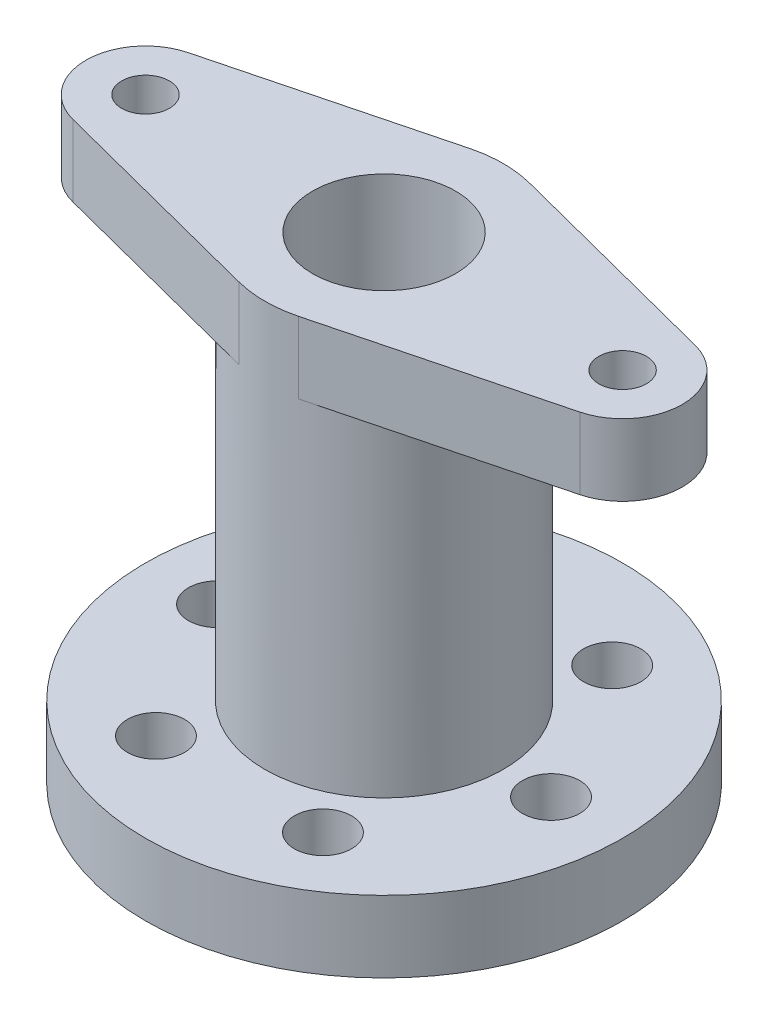
ISO-10303-21;
HEADER;
FILE_DESCRIPTION(('STEP AP214'),'2;1');
FILE_NAME('part.step','',(''),(''),'','','');
FILE_SCHEMA(('AUTOMOTIVE_DESIGN { 1 0 10303 214 1 1 1 1 }'));
ENDSEC;
DATA;
#1=APPLICATION_CONTEXT('core data for automotive mechanical design processes');
#2=APPLICATION_PROTOCOL_DEFINITION('international standard','automotive_design',2000,#1);
#3=PRODUCT_CONTEXT('',#1,'mechanical');
#4=PRODUCT('Part','Part','',(#3));
#5=PRODUCT_RELATED_PRODUCT_CATEGORY('part','',(#4));
#6=PRODUCT_DEFINITION_FORMATION('','',#4);
#7=PRODUCT_DEFINITION_CONTEXT('part definition',#1,'design');
#8=PRODUCT_DEFINITION('design','',#6,#7);
#9=PRODUCT_DEFINITION_SHAPE('','',#8);
#10=(LENGTH_UNIT() NAMED_UNIT(*) SI_UNIT(.MILLI.,.METRE.));
#11=(NAMED_UNIT(*) PLANE_ANGLE_UNIT() SI_UNIT($,.RADIAN.));
#12=(NAMED_UNIT(*) SI_UNIT($,.STERADIAN.) SOLID_ANGLE_UNIT());
#13=UNCERTAINTY_MEASURE_WITH_UNIT(LENGTH_MEASURE(1.E-05),#10,'distance_accuracy_value','');
#14=(GEOMETRIC_REPRESENTATION_CONTEXT(3) GLOBAL_UNCERTAINTY_ASSIGNED_CONTEXT((#13)) GLOBAL_UNIT_ASSIGNED_CONTEXT((#10,
#11,#12)) REPRESENTATION_CONTEXT('',''));
#15=CARTESIAN_POINT('',(0.,0.,0.));
#16=DIRECTION('',(0.,0.,1.));
#17=DIRECTION('',(1.,0.,0.));
#18=AXIS2_PLACEMENT_3D('',#15,#16,#17);
#19=CARTESIAN_POINT('',(0.,15.,0.));
#20=DIRECTION('',(0.,1.,0.));
#21=DIRECTION('',(0.,0.,1.));
#22=AXIS2_PLACEMENT_3D('',#19,#20,#21);
#23=PLANE('',#22);
#24=CARTESIAN_POINT('',(0.,15.,0.));
#25=DIRECTION('',(0.,1.,0.));
#26=DIRECTION('',(0.,0.,1.));
#27=AXIS2_PLACEMENT_3D('',#24,#25,#26);
#28=CIRCLE('',#27,25.);
#29=CARTESIAN_POINT('',(0.,15.,25.));
#30=VERTEX_POINT('',#29);
#31=EDGE_CURVE('E135',#30,#30,#28,.T.);
#32=ORIENTED_EDGE('',*,*,#31,.F.);
#33=EDGE_LOOP('',(#32));
#34=FACE_BOUND('',#33,.T.);
#35=CARTESIAN_POINT('',(17.4999999999997,15.,30.3108891324555));
#36=DIRECTION('',(0.,1.,0.));
#37=DIRECTION('',(0.,0.,1.));
#38=AXIS2_PLACEMENT_3D('',#35,#36,#37);
#39=CIRCLE('',#38,6.);
#40=CARTESIAN_POINT('',(17.4999999999997,15.,36.3108891324555));
#41=VERTEX_POINT('',#40);
#42=EDGE_CURVE('E157',#41,#41,#39,.T.);
#43=ORIENTED_EDGE('',*,*,#42,.F.);
#44=EDGE_LOOP('',(#43));
#45=FACE_BOUND('',#44,.T.);
#46=CARTESIAN_POINT('',(17.5000000000001,15.,-30.3108891324553));
#47=DIRECTION('',(0.,1.,0.));
#48=DIRECTION('',(0.,0.,1.));
#49=AXIS2_PLACEMENT_3D('',#46,#47,#48);
#50=CIRCLE('',#49,6.);
#51=CARTESIAN_POINT('',(17.5000000000001,15.,-24.3108891324553));
#52=VERTEX_POINT('',#51);
#53=EDGE_CURVE('E173',#52,#52,#50,.T.);
#54=ORIENTED_EDGE('',*,*,#53,.F.);
#55=EDGE_LOOP('',(#54));
#56=FACE_BOUND('',#55,.T.);
#57=CARTESIAN_POINT('',(-35.,15.,0.));
#58=DIRECTION('',(0.,1.,0.));
#59=DIRECTION('',(0.,0.,1.));
#60=AXIS2_PLACEMENT_3D('',#57,#58,#59);
#61=CIRCLE('',#60,6.);
#62=CARTESIAN_POINT('',(-35.,15.,6.));
#63=VERTEX_POINT('',#62);
#64=EDGE_CURVE('E189',#63,#63,#61,.T.);
#65=ORIENTED_EDGE('',*,*,#64,.F.);
#66=EDGE_LOOP('',(#65));
#67=FACE_BOUND('',#66,.T.);
#68=CARTESIAN_POINT('',(0.,15.,0.));
#69=DIRECTION('',(0.,1.,0.));
#70=DIRECTION('',(0.,0.,1.));
#71=AXIS2_PLACEMENT_3D('',#68,#69,#70);
#72=CIRCLE('',#71,50.);
#73=CARTESIAN_POINT('',(0.,15.,50.));
#74=VERTEX_POINT('',#73);
#75=EDGE_CURVE('E51',#74,#74,#72,.T.);
#76=ORIENTED_EDGE('',*,*,#75,.T.);
#77=EDGE_LOOP('',(#76));
#78=FACE_BOUND('',#77,.T.);
#79=CARTESIAN_POINT('',(-17.4999999999999,15.,-30.3108891324554));
#80=DIRECTION('',(0.,1.,0.));
#81=DIRECTION('',(0.,0.,1.));
#82=AXIS2_PLACEMENT_3D('',#79,#80,#81);
#83=CIRCLE('',#82,6.);
#84=CARTESIAN_POINT('',(-17.4999999999999,15.,-24.3108891324554));
#85=VERTEX_POINT('',#84);
#86=EDGE_CURVE('E181',#85,#85,#83,.T.);
#87=ORIENTED_EDGE('',*,*,#86,.F.);
#88=EDGE_LOOP('',(#87));
#89=FACE_BOUND('',#88,.T.);
#90=CARTESIAN_POINT('',(35.,15.,2.44403693719019E-13));
#91=DIRECTION('',(0.,1.,0.));
#92=DIRECTION('',(0.,0.,1.));
#93=AXIS2_PLACEMENT_3D('',#90,#91,#92);
#94=CIRCLE('',#93,6.);
#95=CARTESIAN_POINT('',(35.,15.,6.00000000000025));
#96=VERTEX_POINT('',#95);
#97=EDGE_CURVE('E165',#96,#96,#94,.T.);
#98=ORIENTED_EDGE('',*,*,#97,.F.);
#99=EDGE_LOOP('',(#98));
#100=FACE_BOUND('',#99,.T.);
#101=CARTESIAN_POINT('',(-17.5000000000004,15.,30.3108891324552));
#102=DIRECTION('',(0.,1.,0.));
#103=DIRECTION('',(0.,0.,1.));
#104=AXIS2_PLACEMENT_3D('',#101,#102,#103);
#105=CIRCLE('',#104,6.);
#106=CARTESIAN_POINT('',(-17.5000000000004,15.,36.3108891324552));
#107=VERTEX_POINT('',#106);
#108=EDGE_CURVE('E149',#107,#107,#105,.T.);
#109=ORIENTED_EDGE('',*,*,#108,.F.);
#110=EDGE_LOOP('',(#109));
#111=FACE_BOUND('',#110,.T.);
#112=ADVANCED_FACE('F42',(#34,#45,#56,#67,#78,#89,#100,#111),#23,.T.);
#113=CARTESIAN_POINT('',(0.,0.,0.));
#114=DIRECTION('',(0.,1.,0.));
#115=DIRECTION('',(0.,0.,1.));
#116=AXIS2_PLACEMENT_3D('',#113,#114,#115);
#117=PLANE('',#116);
#118=CARTESIAN_POINT('',(0.,0.,0.));
#119=DIRECTION('',(0.,1.,0.));
#120=DIRECTION('',(0.,0.,1.));
#121=AXIS2_PLACEMENT_3D('',#118,#119,#120);
#122=CIRCLE('',#121,50.);
#123=CARTESIAN_POINT('',(0.,0.,50.));
#124=VERTEX_POINT('',#123);
#125=EDGE_CURVE('E193',#124,#124,#122,.T.);
#126=ORIENTED_EDGE('',*,*,#125,.F.);
#127=EDGE_LOOP('',(#126));
#128=FACE_BOUND('',#127,.T.);
#129=CARTESIAN_POINT('',(-35.,0.,0.));
#130=DIRECTION('',(0.,1.,0.));
#131=DIRECTION('',(0.,0.,1.));
#132=AXIS2_PLACEMENT_3D('',#129,#130,#131);
#133=CIRCLE('',#132,6.);
#134=CARTESIAN_POINT('',(-35.,0.,6.));
#135=VERTEX_POINT('',#134);
#136=EDGE_CURVE('E185',#135,#135,#133,.T.);
#137=ORIENTED_EDGE('',*,*,#136,.T.);
#138=EDGE_LOOP('',(#137));
#139=FACE_BOUND('',#138,.T.);
#140=CARTESIAN_POINT('',(-17.4999999999999,0.,-30.3108891324554));
#141=DIRECTION('',(0.,1.,0.));
#142=DIRECTION('',(0.,0.,1.));
#143=AXIS2_PLACEMENT_3D('',#140,#141,#142);
#144=CIRCLE('',#143,6.);
#145=CARTESIAN_POINT('',(-17.4999999999999,0.,-24.3108891324554));
#146=VERTEX_POINT('',#145);
#147=EDGE_CURVE('E177',#146,#146,#144,.T.);
#148=ORIENTED_EDGE('',*,*,#147,.T.);
#149=EDGE_LOOP('',(#148));
#150=FACE_BOUND('',#149,.T.);
#151=CARTESIAN_POINT('',(17.5000000000001,0.,-30.3108891324553));
#152=DIRECTION('',(0.,1.,0.));
#153=DIRECTION('',(0.,0.,1.));
#154=AXIS2_PLACEMENT_3D('',#151,#152,#153);
#155=CIRCLE('',#154,6.);
#156=CARTESIAN_POINT('',(17.5000000000001,0.,-24.3108891324553));
#157=VERTEX_POINT('',#156);
#158=EDGE_CURVE('E169',#157,#157,#155,.T.);
#159=ORIENTED_EDGE('',*,*,#158,.T.);
#160=EDGE_LOOP('',(#159));
#161=FACE_BOUND('',#160,.T.);
#162=CARTESIAN_POINT('',(35.,0.,2.44403693719019E-13));
#163=DIRECTION('',(0.,1.,0.));
#164=DIRECTION('',(0.,0.,1.));
#165=AXIS2_PLACEMENT_3D('',#162,#163,#164);
#166=CIRCLE('',#165,6.);
#167=CARTESIAN_POINT('',(35.,0.,6.00000000000025));
#168=VERTEX_POINT('',#167);
#169=EDGE_CURVE('E161',#168,#168,#166,.T.);
#170=ORIENTED_EDGE('',*,*,#169,.T.);
#171=EDGE_LOOP('',(#170));
#172=FACE_BOUND('',#171,.T.);
#173=CARTESIAN_POINT('',(17.4999999999997,0.,30.3108891324555));
#174=DIRECTION('',(0.,1.,0.));
#175=DIRECTION('',(0.,0.,1.));
#176=AXIS2_PLACEMENT_3D('',#173,#174,#175);
#177=CIRCLE('',#176,6.);
#178=CARTESIAN_POINT('',(17.4999999999997,0.,36.3108891324555));
#179=VERTEX_POINT('',#178);
#180=EDGE_CURVE('E153',#179,#179,#177,.T.);
#181=ORIENTED_EDGE('',*,*,#180,.T.);
#182=EDGE_LOOP('',(#181));
#183=FACE_BOUND('',#182,.T.);
#184=CARTESIAN_POINT('',(-17.5000000000004,0.,30.3108891324552));
#185=DIRECTION('',(0.,1.,0.));
#186=DIRECTION('',(0.,0.,1.));
#187=AXIS2_PLACEMENT_3D('',#184,#185,#186);
#188=CIRCLE('',#187,6.);
#189=CARTESIAN_POINT('',(-17.5000000000004,0.,36.3108891324552));
#190=VERTEX_POINT('',#189);
#191=EDGE_CURVE('E147',#190,#190,#188,.T.);
#192=ORIENTED_EDGE('',*,*,#191,.T.);
#193=EDGE_LOOP('',(#192));
#194=FACE_BOUND('',#193,.T.);
#195=ADVANCED_FACE('F204',(#128,#139,#150,#161,#172,#183,#194),#117,.F.);
#196=CARTESIAN_POINT('',(0.,15.,0.));
#197=DIRECTION('',(0.,-1.,0.));
#198=DIRECTION('',(0.,0.,-1.));
#199=AXIS2_PLACEMENT_3D('',#196,#197,#198);
#200=CYLINDRICAL_SURFACE('',#199,50.);
#201=ORIENTED_EDGE('',*,*,#75,.F.);
#202=EDGE_LOOP('',(#201));
#203=FACE_BOUND('',#202,.T.);
#204=ORIENTED_EDGE('',*,*,#125,.T.);
#205=EDGE_LOOP('',(#204));
#206=FACE_BOUND('',#205,.T.);
#207=ADVANCED_FACE('F44',(#203,#206),#200,.T.);
#208=CARTESIAN_POINT('',(-35.,15.,0.));
#209=DIRECTION('',(0.,-1.,0.));
#210=DIRECTION('',(0.,0.,-1.));
#211=AXIS2_PLACEMENT_3D('',#208,#209,#210);
#212=CYLINDRICAL_SURFACE('',#211,6.);
#213=ORIENTED_EDGE('',*,*,#64,.T.);
#214=EDGE_LOOP('',(#213));
#215=FACE_BOUND('',#214,.T.);
#216=ORIENTED_EDGE('',*,*,#136,.F.);
#217=EDGE_LOOP('',(#216));
#218=FACE_BOUND('',#217,.T.);
#219=ADVANCED_FACE('F527',(#215,#218),#212,.F.);
#220=CARTESIAN_POINT('',(-17.4999999999999,15.,-30.3108891324554));
#221=DIRECTION('',(0.,-1.,0.));
#222=DIRECTION('',(0.,0.,-1.));
#223=AXIS2_PLACEMENT_3D('',#220,#221,#222);
#224=CYLINDRICAL_SURFACE('',#223,6.);
#225=ORIENTED_EDGE('',*,*,#86,.T.);
#226=EDGE_LOOP('',(#225));
#227=FACE_BOUND('',#226,.T.);
#228=ORIENTED_EDGE('',*,*,#147,.F.);
#229=EDGE_LOOP('',(#228));
#230=FACE_BOUND('',#229,.T.);
#231=ADVANCED_FACE('F516',(#227,#230),#224,.F.);
#232=CARTESIAN_POINT('',(17.5000000000001,15.,-30.3108891324553));
#233=DIRECTION('',(0.,-1.,0.));
#234=DIRECTION('',(0.,0.,-1.));
#235=AXIS2_PLACEMENT_3D('',#232,#233,#234);
#236=CYLINDRICAL_SURFACE('',#235,6.);
#237=ORIENTED_EDGE('',*,*,#53,.T.);
#238=EDGE_LOOP('',(#237));
#239=FACE_BOUND('',#238,.T.);
#240=ORIENTED_EDGE('',*,*,#158,.F.);
#241=EDGE_LOOP('',(#240));
#242=FACE_BOUND('',#241,.T.);
#243=ADVANCED_FACE('F505',(#239,#242),#236,.F.);
#244=CARTESIAN_POINT('',(35.,15.,2.44403693719019E-13));
#245=DIRECTION('',(0.,-1.,0.));
#246=DIRECTION('',(0.,0.,-1.));
#247=AXIS2_PLACEMENT_3D('',#244,#245,#246);
#248=CYLINDRICAL_SURFACE('',#247,6.);
#249=ORIENTED_EDGE('',*,*,#97,.T.);
#250=EDGE_LOOP('',(#249));
#251=FACE_BOUND('',#250,.T.);
#252=ORIENTED_EDGE('',*,*,#169,.F.);
#253=EDGE_LOOP('',(#252));
#254=FACE_BOUND('',#253,.T.);
#255=ADVANCED_FACE('F231',(#251,#254),#248,.F.);
#256=CARTESIAN_POINT('',(17.4999999999997,15.,30.3108891324555));
#257=DIRECTION('',(0.,-1.,0.));
#258=DIRECTION('',(0.,0.,-1.));
#259=AXIS2_PLACEMENT_3D('',#256,#257,#258);
#260=CYLINDRICAL_SURFACE('',#259,6.);
#261=ORIENTED_EDGE('',*,*,#42,.T.);
#262=EDGE_LOOP('',(#261));
#263=FACE_BOUND('',#262,.T.);
#264=ORIENTED_EDGE('',*,*,#180,.F.);
#265=EDGE_LOOP('',(#264));
#266=FACE_BOUND('',#265,.T.);
#267=ADVANCED_FACE('F222',(#263,#266),#260,.F.);
#268=CARTESIAN_POINT('',(-17.5000000000004,15.,30.3108891324552));
#269=DIRECTION('',(0.,-1.,0.));
#270=DIRECTION('',(0.,0.,-1.));
#271=AXIS2_PLACEMENT_3D('',#268,#269,#270);
#272=CYLINDRICAL_SURFACE('',#271,6.);
#273=ORIENTED_EDGE('',*,*,#108,.T.);
#274=EDGE_LOOP('',(#273));
#275=FACE_BOUND('',#274,.T.);
#276=ORIENTED_EDGE('',*,*,#191,.F.);
#277=EDGE_LOOP('',(#276));
#278=FACE_BOUND('',#277,.T.);
#279=ADVANCED_FACE('F219',(#275,#278),#272,.F.);
#280=CARTESIAN_POINT('',(0.,85.,0.));
#281=DIRECTION('',(0.,-1.,0.));
#282=DIRECTION('',(0.,0.,-1.));
#283=AXIS2_PLACEMENT_3D('',#280,#281,#282);
#284=CYLINDRICAL_SURFACE('',#283,25.);
#285=CARTESIAN_POINT('',(0.,85.,0.));
#286=DIRECTION('',(0.,1.,0.));
#287=DIRECTION('',(0.,0.,1.));
#288=AXIS2_PLACEMENT_3D('',#285,#286,#287);
#289=CIRCLE('',#288,25.);
#290=CARTESIAN_POINT('',(6.25000000000001,85.,24.2061459137964));
#291=VERTEX_POINT('',#290);
#292=CARTESIAN_POINT('',(6.25000000000001,85.,-24.2061459137964));
#293=VERTEX_POINT('',#292);
#294=EDGE_CURVE('E145',#291,#293,#289,.T.);
#295=ORIENTED_EDGE('',*,*,#294,.F.);
#296=DIRECTION('',(0.,-1.,0.));
#297=VECTOR('',#296,1.);
#298=CARTESIAN_POINT('',(6.25000000000001,100.,24.2061459137964));
#299=LINE('',#298,#297);
#300=CARTESIAN_POINT('',(6.25000000000001,100.,24.2061459137964));
#301=VERTEX_POINT('',#300);
#302=EDGE_CURVE('E141',#301,#291,#299,.T.);
#303=ORIENTED_EDGE('',*,*,#302,.F.);
#304=CARTESIAN_POINT('',(0.,100.,0.));
#305=DIRECTION('',(0.,1.,0.));
#306=DIRECTION('',(0.,0.,1.));
#307=AXIS2_PLACEMENT_3D('',#304,#305,#306);
#308=CIRCLE('',#307,25.);
#309=CARTESIAN_POINT('',(-6.25000000000001,100.,24.2061459137964));
#310=VERTEX_POINT('',#309);
#311=EDGE_CURVE('E118',#310,#301,#308,.T.);
#312=ORIENTED_EDGE('',*,*,#311,.F.);
#313=DIRECTION('',(0.,-1.,0.));
#314=VECTOR('',#313,1.);
#315=CARTESIAN_POINT('',(-6.25000000000001,100.,24.2061459137964));
#316=LINE('',#315,#314);
#317=CARTESIAN_POINT('',(-6.25000000000001,85.,24.2061459137964));
#318=VERTEX_POINT('',#317);
#319=EDGE_CURVE('E114',#310,#318,#316,.T.);
#320=ORIENTED_EDGE('',*,*,#319,.T.);
#321=CARTESIAN_POINT('',(-6.25000000000001,85.,-24.2061459137964));
#322=VERTEX_POINT('',#321);
#323=EDGE_CURVE('E58',#322,#318,#289,.T.);
#324=ORIENTED_EDGE('',*,*,#323,.F.);
#325=DIRECTION('',(0.,-1.,0.));
#326=VECTOR('',#325,1.);
#327=CARTESIAN_POINT('',(-6.25000000000001,100.,-24.2061459137964));
#328=LINE('',#327,#326);
#329=CARTESIAN_POINT('',(-6.25000000000001,100.,-24.2061459137964));
#330=VERTEX_POINT('',#329);
#331=EDGE_CURVE('E313',#330,#322,#328,.T.);
#332=ORIENTED_EDGE('',*,*,#331,.F.);
#333=CARTESIAN_POINT('',(0.,100.,0.));
#334=DIRECTION('',(0.,1.,0.));
#335=DIRECTION('',(0.,0.,1.));
#336=AXIS2_PLACEMENT_3D('',#333,#334,#335);
#337=CIRCLE('',#336,25.);
#338=CARTESIAN_POINT('',(6.25000000000001,100.,-24.2061459137964));
#339=VERTEX_POINT('',#338);
#340=EDGE_CURVE('E350',#339,#330,#337,.T.);
#341=ORIENTED_EDGE('',*,*,#340,.F.);
#342=DIRECTION('',(0.,-1.,0.));
#343=VECTOR('',#342,1.);
#344=CARTESIAN_POINT('',(6.25000000000001,100.,-24.2061459137964));
#345=LINE('',#344,#343);
#346=EDGE_CURVE('E316',#339,#293,#345,.T.);
#347=ORIENTED_EDGE('',*,*,#346,.T.);
#348=EDGE_LOOP('',(#295,#303,#312,#320,#324,#332,#341,#347));
#349=FACE_BOUND('',#348,.T.);
#350=ORIENTED_EDGE('',*,*,#31,.T.);
#351=EDGE_LOOP('',(#350));
#352=FACE_BOUND('',#351,.T.);
#353=ADVANCED_FACE('F221',(#349,#352),#284,.T.);
#354=CARTESIAN_POINT('',(-50.,85.,0.));
#355=DIRECTION('',(0.,1.,0.));
#356=DIRECTION('',(0.,0.,1.));
#357=AXIS2_PLACEMENT_3D('',#354,#355,#356);
#358=PLANE('',#357);
#359=CARTESIAN_POINT('',(50.,85.,0.));
#360=DIRECTION('',(0.,1.,0.));
#361=DIRECTION('',(0.,0.,1.));
#362=AXIS2_PLACEMENT_3D('',#359,#360,#361);
#363=CIRCLE('',#362,5.);
#364=CARTESIAN_POINT('',(50.,85.,5.));
#365=VERTEX_POINT('',#364);
#366=EDGE_CURVE('E347',#365,#365,#363,.T.);
#367=ORIENTED_EDGE('',*,*,#366,.T.);
#368=EDGE_LOOP('',(#367));
#369=FACE_BOUND('',#368,.T.);
#370=DIRECTION('',(0.968245836551854,0.,-0.25));
#371=VECTOR('',#370,1.);
#372=CARTESIAN_POINT('',(53.125,85.,12.1030729568982));
#373=LINE('',#372,#371);
#374=CARTESIAN_POINT('',(53.125,85.,12.1030729568982));
#375=VERTEX_POINT('',#374);
#376=EDGE_CURVE('E333',#291,#375,#373,.T.);
#377=ORIENTED_EDGE('',*,*,#376,.F.);
#378=ORIENTED_EDGE('',*,*,#294,.T.);
#379=DIRECTION('',(-0.968245836551854,0.,-0.25));
#380=VECTOR('',#379,1.);
#381=CARTESIAN_POINT('',(53.125,85.,-12.1030729568982));
#382=LINE('',#381,#380);
#383=CARTESIAN_POINT('',(53.125,85.,-12.1030729568982));
#384=VERTEX_POINT('',#383);
#385=EDGE_CURVE('E302',#384,#293,#382,.T.);
#386=ORIENTED_EDGE('',*,*,#385,.F.);
#387=CARTESIAN_POINT('',(50.,85.,0.));
#388=DIRECTION('',(0.,1.,0.));
#389=DIRECTION('',(0.,0.,1.));
#390=AXIS2_PLACEMENT_3D('',#387,#388,#389);
#391=CIRCLE('',#390,12.5);
#392=EDGE_CURVE('E306',#375,#384,#391,.T.);
#393=ORIENTED_EDGE('',*,*,#392,.F.);
#394=EDGE_LOOP('',(#377,#378,#386,#393));
#395=FACE_BOUND('',#394,.T.);
#396=ADVANCED_FACE('F229',(#369,#395),#358,.F.);
#397=CARTESIAN_POINT('',(-50.,85.,0.));
#398=DIRECTION('',(0.,1.,0.));
#399=DIRECTION('',(0.,0.,1.));
#400=AXIS2_PLACEMENT_3D('',#397,#398,#399);
#401=CIRCLE('',#400,5.);
#402=CARTESIAN_POINT('',(-50.,85.,5.));
#403=VERTEX_POINT('',#402);
#404=EDGE_CURVE('E300',#403,#403,#401,.T.);
#405=ORIENTED_EDGE('',*,*,#404,.T.);
#406=EDGE_LOOP('',(#405));
#407=FACE_BOUND('',#406,.T.);
#408=DIRECTION('',(-0.968245836551854,0.,0.25));
#409=VECTOR('',#408,1.);
#410=CARTESIAN_POINT('',(-53.125,85.,-12.1030729568982));
#411=LINE('',#410,#409);
#412=CARTESIAN_POINT('',(-53.125,85.,-12.1030729568982));
#413=VERTEX_POINT('',#412);
#414=EDGE_CURVE('E129',#322,#413,#411,.T.);
#415=ORIENTED_EDGE('',*,*,#414,.F.);
#416=ORIENTED_EDGE('',*,*,#323,.T.);
#417=DIRECTION('',(0.968245836551854,0.,0.25));
#418=VECTOR('',#417,1.);
#419=CARTESIAN_POINT('',(-53.125,85.,12.1030729568982));
#420=LINE('',#419,#418);
#421=CARTESIAN_POINT('',(-53.125,85.,12.1030729568982));
#422=VERTEX_POINT('',#421);
#423=EDGE_CURVE('E339',#422,#318,#420,.T.);
#424=ORIENTED_EDGE('',*,*,#423,.F.);
#425=CARTESIAN_POINT('',(-50.,85.,0.));
#426=DIRECTION('',(0.,1.,0.));
#427=DIRECTION('',(0.,0.,1.));
#428=AXIS2_PLACEMENT_3D('',#425,#426,#427);
#429=CIRCLE('',#428,12.5);
#430=EDGE_CURVE('E133',#413,#422,#429,.T.);
#431=ORIENTED_EDGE('',*,*,#430,.F.);
#432=EDGE_LOOP('',(#415,#416,#424,#431));
#433=FACE_BOUND('',#432,.T.);
#434=ADVANCED_FACE('F272',(#407,#433),#358,.F.);
#435=CARTESIAN_POINT('',(-50.,100.,0.));
#436=DIRECTION('',(0.,-1.,0.));
#437=DIRECTION('',(0.,0.,-1.));
#438=AXIS2_PLACEMENT_3D('',#435,#436,#437);
#439=CYLINDRICAL_SURFACE('',#438,12.5);
#440=ORIENTED_EDGE('',*,*,#430,.T.);
#441=DIRECTION('',(0.,-1.,0.));
#442=VECTOR('',#441,1.);
#443=CARTESIAN_POINT('',(-53.125,100.,12.1030729568982));
#444=LINE('',#443,#442);
#445=CARTESIAN_POINT('',(-53.125,100.,12.1030729568982));
#446=VERTEX_POINT('',#445);
#447=EDGE_CURVE('E112',#446,#422,#444,.T.);
#448=ORIENTED_EDGE('',*,*,#447,.F.);
#449=CARTESIAN_POINT('',(-50.,100.,0.));
#450=DIRECTION('',(0.,1.,0.));
#451=DIRECTION('',(0.,0.,1.));
#452=AXIS2_PLACEMENT_3D('',#449,#450,#451);
#453=CIRCLE('',#452,12.5);
#454=CARTESIAN_POINT('',(-53.125,100.,-12.1030729568982));
#455=VERTEX_POINT('',#454);
#456=EDGE_CURVE('E119',#455,#446,#453,.T.);
#457=ORIENTED_EDGE('',*,*,#456,.F.);
#458=DIRECTION('',(0.,-1.,0.));
#459=VECTOR('',#458,1.);
#460=CARTESIAN_POINT('',(-53.125,100.,-12.1030729568982));
#461=LINE('',#460,#459);
#462=EDGE_CURVE('E310',#455,#413,#461,.T.);
#463=ORIENTED_EDGE('',*,*,#462,.T.);
#464=EDGE_LOOP('',(#440,#448,#457,#463));
#465=FACE_BOUND('',#464,.T.);
#466=ADVANCED_FACE('F131',(#465),#439,.T.);
#467=CARTESIAN_POINT('',(-53.125,100.,12.1030729568982));
#468=DIRECTION('',(0.25,0.,-0.968245836551854));
#469=DIRECTION('',(-0.968245836551854,0.,-0.25));
#470=AXIS2_PLACEMENT_3D('',#467,#468,#469);
#471=PLANE('',#470);
#472=ORIENTED_EDGE('',*,*,#423,.T.);
#473=ORIENTED_EDGE('',*,*,#319,.F.);
#474=DIRECTION('',(0.968245836551854,0.,0.25));
#475=VECTOR('',#474,1.);
#476=CARTESIAN_POINT('',(-53.125,100.,12.1030729568982));
#477=LINE('',#476,#475);
#478=EDGE_CURVE('E108',#446,#310,#477,.T.);
#479=ORIENTED_EDGE('',*,*,#478,.F.);
#480=ORIENTED_EDGE('',*,*,#447,.T.);
#481=EDGE_LOOP('',(#472,#473,#479,#480));
#482=FACE_BOUND('',#481,.T.);
#483=ADVANCED_FACE('F110',(#482),#471,.F.);
#484=CARTESIAN_POINT('',(53.125,100.,12.1030729568982));
#485=DIRECTION('',(-0.25,0.,-0.968245836551854));
#486=DIRECTION('',(-0.968245836551854,0.,0.25));
#487=AXIS2_PLACEMENT_3D('',#484,#485,#486);
#488=PLANE('',#487);
#489=ORIENTED_EDGE('',*,*,#376,.T.);
#490=DIRECTION('',(0.,-1.,0.));
#491=VECTOR('',#490,1.);
#492=CARTESIAN_POINT('',(53.125,100.,12.1030729568982));
#493=LINE('',#492,#491);
#494=CARTESIAN_POINT('',(53.125,100.,12.1030729568982));
#495=VERTEX_POINT('',#494);
#496=EDGE_CURVE('E324',#495,#375,#493,.T.);
#497=ORIENTED_EDGE('',*,*,#496,.F.);
#498=DIRECTION('',(0.968245836551854,0.,-0.25));
#499=VECTOR('',#498,1.);
#500=CARTESIAN_POINT('',(53.125,100.,12.1030729568982));
#501=LINE('',#500,#499);
#502=EDGE_CURVE('E334',#301,#495,#501,.T.);
#503=ORIENTED_EDGE('',*,*,#502,.F.);
#504=ORIENTED_EDGE('',*,*,#302,.T.);
#505=EDGE_LOOP('',(#489,#497,#503,#504));
#506=FACE_BOUND('',#505,.T.);
#507=ADVANCED_FACE('F284',(#506),#488,.F.);
#508=CARTESIAN_POINT('',(50.,100.,0.));
#509=DIRECTION('',(0.,-1.,0.));
#510=DIRECTION('',(0.,0.,-1.));
#511=AXIS2_PLACEMENT_3D('',#508,#509,#510);
#512=CYLINDRICAL_SURFACE('',#511,12.5);
#513=ORIENTED_EDGE('',*,*,#392,.T.);
#514=DIRECTION('',(0.,-1.,0.));
#515=VECTOR('',#514,1.);
#516=CARTESIAN_POINT('',(53.125,100.,-12.1030729568982));
#517=LINE('',#516,#515);
#518=CARTESIAN_POINT('',(53.125,100.,-12.1030729568982));
#519=VERTEX_POINT('',#518);
#520=EDGE_CURVE('E320',#519,#384,#517,.T.);
#521=ORIENTED_EDGE('',*,*,#520,.F.);
#522=CARTESIAN_POINT('',(50.,100.,0.));
#523=DIRECTION('',(0.,1.,0.));
#524=DIRECTION('',(0.,0.,1.));
#525=AXIS2_PLACEMENT_3D('',#522,#523,#524);
#526=CIRCLE('',#525,12.5);
#527=EDGE_CURVE('E356',#495,#519,#526,.T.);
#528=ORIENTED_EDGE('',*,*,#527,.F.);
#529=ORIENTED_EDGE('',*,*,#496,.T.);
#530=EDGE_LOOP('',(#513,#521,#528,#529));
#531=FACE_BOUND('',#530,.T.);
#532=ADVANCED_FACE('F280',(#531),#512,.T.);
#533=CARTESIAN_POINT('',(53.125,100.,-12.1030729568982));
#534=DIRECTION('',(-0.25,0.,0.968245836551854));
#535=DIRECTION('',(0.968245836551854,0.,0.25));
#536=AXIS2_PLACEMENT_3D('',#533,#534,#535);
#537=PLANE('',#536);
#538=ORIENTED_EDGE('',*,*,#385,.T.);
#539=ORIENTED_EDGE('',*,*,#346,.F.);
#540=DIRECTION('',(-0.968245836551854,0.,-0.25));
#541=VECTOR('',#540,1.);
#542=CARTESIAN_POINT('',(53.125,100.,-12.1030729568982));
#543=LINE('',#542,#541);
#544=EDGE_CURVE('E353',#519,#339,#543,.T.);
#545=ORIENTED_EDGE('',*,*,#544,.F.);
#546=ORIENTED_EDGE('',*,*,#520,.T.);
#547=EDGE_LOOP('',(#538,#539,#545,#546));
#548=FACE_BOUND('',#547,.T.);
#549=ADVANCED_FACE('F276',(#548),#537,.F.);
#550=CARTESIAN_POINT('',(-53.125,100.,-12.1030729568982));
#551=DIRECTION('',(0.25,0.,0.968245836551854));
#552=DIRECTION('',(0.968245836551854,0.,-0.25));
#553=AXIS2_PLACEMENT_3D('',#550,#551,#552);
#554=PLANE('',#553);
#555=ORIENTED_EDGE('',*,*,#414,.T.);
#556=ORIENTED_EDGE('',*,*,#462,.F.);
#557=DIRECTION('',(-0.968245836551854,0.,0.25));
#558=VECTOR('',#557,1.);
#559=CARTESIAN_POINT('',(-53.125,100.,-12.1030729568982));
#560=LINE('',#559,#558);
#561=EDGE_CURVE('E124',#330,#455,#560,.T.);
#562=ORIENTED_EDGE('',*,*,#561,.F.);
#563=ORIENTED_EDGE('',*,*,#331,.T.);
#564=EDGE_LOOP('',(#555,#556,#562,#563));
#565=FACE_BOUND('',#564,.T.);
#566=ADVANCED_FACE('F268',(#565),#554,.F.);
#567=CARTESIAN_POINT('',(-50.,100.,0.));
#568=DIRECTION('',(0.,1.,0.));
#569=DIRECTION('',(0.,0.,1.));
#570=AXIS2_PLACEMENT_3D('',#567,#568,#569);
#571=PLANE('',#570);
#572=CARTESIAN_POINT('',(50.,100.,0.));
#573=DIRECTION('',(0.,1.,0.));
#574=DIRECTION('',(0.,0.,1.));
#575=AXIS2_PLACEMENT_3D('',#572,#573,#574);
#576=CIRCLE('',#575,5.);
#577=CARTESIAN_POINT('',(50.,100.,5.));
#578=VERTEX_POINT('',#577);
#579=EDGE_CURVE('E373',#578,#578,#576,.T.);
#580=ORIENTED_EDGE('',*,*,#579,.F.);
#581=EDGE_LOOP('',(#580));
#582=FACE_BOUND('',#581,.T.);
#583=CARTESIAN_POINT('',(-50.,100.,0.));
#584=DIRECTION('',(0.,1.,0.));
#585=DIRECTION('',(0.,0.,1.));
#586=AXIS2_PLACEMENT_3D('',#583,#584,#585);
#587=CIRCLE('',#586,5.);
#588=CARTESIAN_POINT('',(-50.,100.,5.));
#589=VERTEX_POINT('',#588);
#590=EDGE_CURVE('E372',#589,#589,#587,.T.);
#591=ORIENTED_EDGE('',*,*,#590,.F.);
#592=EDGE_LOOP('',(#591));
#593=FACE_BOUND('',#592,.T.);
#594=CARTESIAN_POINT('',(0.,100.,0.));
#595=DIRECTION('',(0.,1.,0.));
#596=DIRECTION('',(0.,0.,1.));
#597=AXIS2_PLACEMENT_3D('',#594,#595,#596);
#598=CIRCLE('',#597,15.);
#599=CARTESIAN_POINT('',(0.,100.,15.));
#600=VERTEX_POINT('',#599);
#601=EDGE_CURVE('E368',#600,#600,#598,.T.);
#602=ORIENTED_EDGE('',*,*,#601,.F.);
#603=EDGE_LOOP('',(#602));
#604=FACE_BOUND('',#603,.T.);
#605=ORIENTED_EDGE('',*,*,#456,.T.);
#606=ORIENTED_EDGE('',*,*,#478,.T.);
#607=ORIENTED_EDGE('',*,*,#311,.T.);
#608=ORIENTED_EDGE('',*,*,#502,.T.);
#609=ORIENTED_EDGE('',*,*,#527,.T.);
#610=ORIENTED_EDGE('',*,*,#544,.T.);
#611=ORIENTED_EDGE('',*,*,#340,.T.);
#612=ORIENTED_EDGE('',*,*,#561,.T.);
#613=EDGE_LOOP('',(#605,#606,#607,#608,#609,#610,#611,#612));
#614=FACE_BOUND('',#613,.T.);
#615=ADVANCED_FACE('F122',(#582,#593,#604,#614),#571,.T.);
#616=CARTESIAN_POINT('',(-50.,60.,0.));
#617=DIRECTION('',(0.,1.,0.));
#618=DIRECTION('',(0.,0.,1.));
#619=AXIS2_PLACEMENT_3D('',#616,#617,#618);
#620=CYLINDRICAL_SURFACE('',#619,5.);
#621=ORIENTED_EDGE('',*,*,#590,.T.);
#622=EDGE_LOOP('',(#621));
#623=FACE_BOUND('',#622,.T.);
#624=ORIENTED_EDGE('',*,*,#404,.F.);
#625=EDGE_LOOP('',(#624));
#626=FACE_BOUND('',#625,.T.);
#627=ADVANCED_FACE('F253',(#623,#626),#620,.F.);
#628=CARTESIAN_POINT('',(50.,60.,0.));
#629=DIRECTION('',(0.,1.,0.));
#630=DIRECTION('',(0.,0.,1.));
#631=AXIS2_PLACEMENT_3D('',#628,#629,#630);
#632=CYLINDRICAL_SURFACE('',#631,5.);
#633=ORIENTED_EDGE('',*,*,#579,.T.);
#634=EDGE_LOOP('',(#633));
#635=FACE_BOUND('',#634,.T.);
#636=ORIENTED_EDGE('',*,*,#366,.F.);
#637=EDGE_LOOP('',(#636));
#638=FACE_BOUND('',#637,.T.);
#639=ADVANCED_FACE('F245',(#635,#638),#632,.F.);
#640=CARTESIAN_POINT('',(0.,15.,0.));
#641=DIRECTION('',(0.,1.,0.));
#642=DIRECTION('',(0.,0.,1.));
#643=AXIS2_PLACEMENT_3D('',#640,#641,#642);
#644=CIRCLE('',#643,15.);
#645=CARTESIAN_POINT('',(0.,15.,15.));
#646=VERTEX_POINT('',#645);
#647=EDGE_CURVE('E11',#646,#646,#644,.F.);
#648=ORIENTED_EDGE('',*,*,#647,.F.);
#649=EDGE_LOOP('',(#648));
#650=FACE_BOUND('',#649,.T.);
#651=ADVANCED_FACE('F237',(#650),#23,.T.);
#652=CARTESIAN_POINT('',(0.,85.,0.));
#653=DIRECTION('',(0.,-1.,0.));
#654=DIRECTION('',(0.,0.,-1.));
#655=AXIS2_PLACEMENT_3D('',#652,#653,#654);
#656=CYLINDRICAL_SURFACE('',#655,15.);
#657=ORIENTED_EDGE('',*,*,#601,.T.);
#658=EDGE_LOOP('',(#657));
#659=FACE_BOUND('',#658,.T.);
#660=ORIENTED_EDGE('',*,*,#647,.T.);
#661=EDGE_LOOP('',(#660));
#662=FACE_BOUND('',#661,.T.);
#663=ADVANCED_FACE('F244',(#659,#662),#656,.F.);
#664=CLOSED_SHELL('',(#112,#195,#207,#219,#231,#243,#255,#267,#279,#353,#396,#434,#466,#483,
#507,#532,#549,#566,#615,#627,#639,#651,#663));
#665=MANIFOLD_SOLID_BREP('B2',#664);
#666=ADVANCED_BREP_SHAPE_REPRESENTATION('',(#18,#665),#14);
#667=SHAPE_DEFINITION_REPRESENTATION(#9,#666);
ENDSEC;
END-ISO-10303-21;
